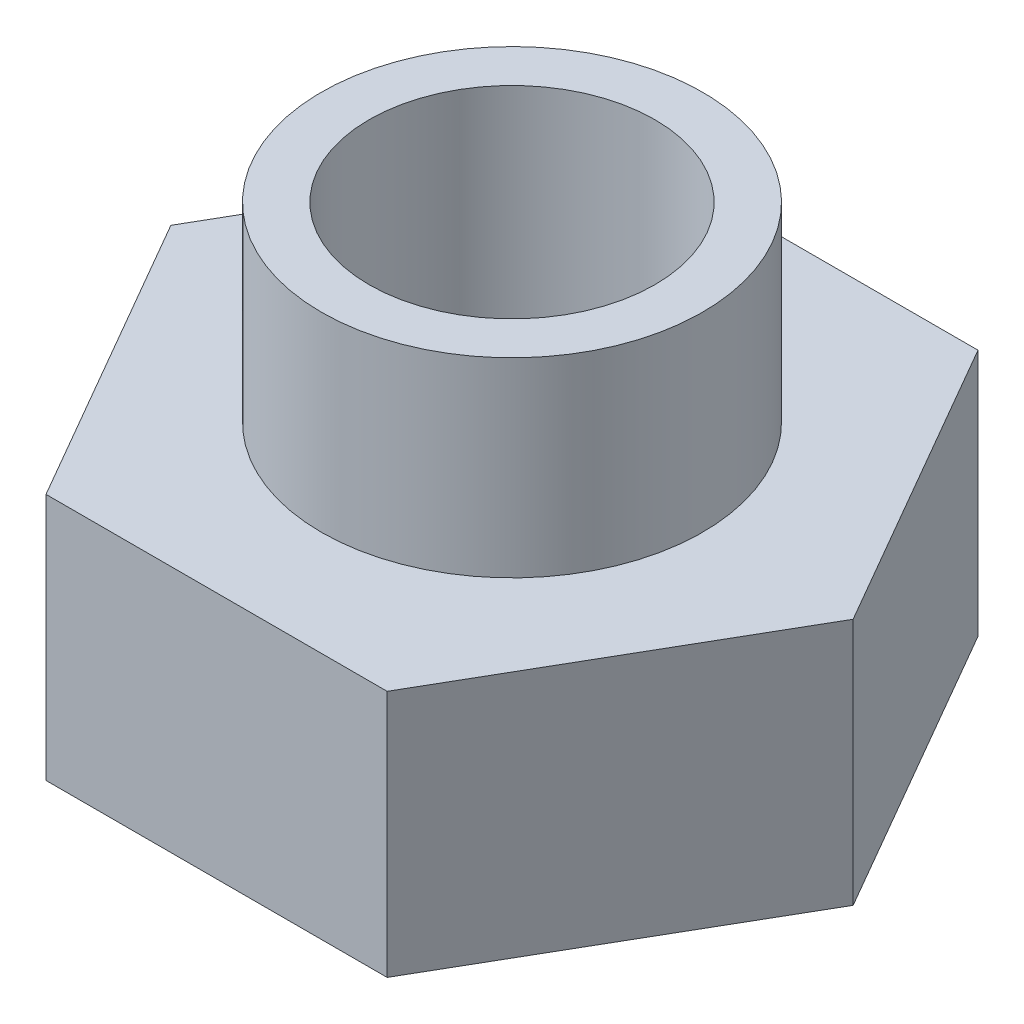
ISO-10303-21;
HEADER;
FILE_DESCRIPTION(('STEP AP214'),'2;1');
FILE_NAME('part.step','',(''),(''),'','','');
FILE_SCHEMA(('AUTOMOTIVE_DESIGN { 1 0 10303 214 1 1 1 1 }'));
ENDSEC;
DATA;
#1=APPLICATION_CONTEXT('core data for automotive mechanical design processes');
#2=APPLICATION_PROTOCOL_DEFINITION('international standard','automotive_design',2000,#1);
#3=PRODUCT_CONTEXT('',#1,'mechanical');
#4=PRODUCT('Part','Part','',(#3));
#5=PRODUCT_RELATED_PRODUCT_CATEGORY('part','',(#4));
#6=PRODUCT_DEFINITION_FORMATION('','',#4);
#7=PRODUCT_DEFINITION_CONTEXT('part definition',#1,'design');
#8=PRODUCT_DEFINITION('design','',#6,#7);
#9=PRODUCT_DEFINITION_SHAPE('','',#8);
#10=(LENGTH_UNIT() NAMED_UNIT(*) SI_UNIT(.MILLI.,.METRE.));
#11=(NAMED_UNIT(*) PLANE_ANGLE_UNIT() SI_UNIT($,.RADIAN.));
#12=(NAMED_UNIT(*) SI_UNIT($,.STERADIAN.) SOLID_ANGLE_UNIT());
#13=UNCERTAINTY_MEASURE_WITH_UNIT(LENGTH_MEASURE(1.E-05),#10,'distance_accuracy_value','');
#14=(GEOMETRIC_REPRESENTATION_CONTEXT(3) GLOBAL_UNCERTAINTY_ASSIGNED_CONTEXT((#13)) GLOBAL_UNIT_ASSIGNED_CONTEXT((#10,
#11,#12)) REPRESENTATION_CONTEXT('',''));
#15=CARTESIAN_POINT('',(0.,0.,0.));
#16=DIRECTION('',(0.,0.,1.));
#17=DIRECTION('',(1.,0.,0.));
#18=AXIS2_PLACEMENT_3D('',#15,#16,#17);
#19=CARTESIAN_POINT('',(8.05240624923115E-13,65.,77.5));
#20=DIRECTION('',(0.,0.,-1.));
#21=DIRECTION('',(-1.,0.,0.));
#22=AXIS2_PLACEMENT_3D('',#19,#20,#21);
#23=PLANE('',#22);
#24=DIRECTION('',(1.,0.,0.));
#25=VECTOR('',#24,1.);
#26=CARTESIAN_POINT('',(8.05240624923115E-13,0.,77.5));
#27=LINE('',#26,#25);
#28=CARTESIAN_POINT('',(-44.7446458621953,0.,77.5000000000005));
#29=VERTEX_POINT('',#28);
#30=CARTESIAN_POINT('',(44.7446458621969,0.,77.4999999999995));
#31=VERTEX_POINT('',#30);
#32=EDGE_CURVE('E123',#29,#31,#27,.T.);
#33=ORIENTED_EDGE('',*,*,#32,.T.);
#34=DIRECTION('',(0.,-1.,0.));
#35=VECTOR('',#34,1.);
#36=CARTESIAN_POINT('',(44.7446458621969,65.,77.4999999999995));
#37=LINE('',#36,#35);
#38=CARTESIAN_POINT('',(44.7446458621969,65.,77.4999999999995));
#39=VERTEX_POINT('',#38);
#40=EDGE_CURVE('E11',#39,#31,#37,.T.);
#41=ORIENTED_EDGE('',*,*,#40,.F.);
#42=DIRECTION('',(1.,0.,0.));
#43=VECTOR('',#42,1.);
#44=CARTESIAN_POINT('',(8.05240624923115E-13,65.,77.5));
#45=LINE('',#44,#43);
#46=CARTESIAN_POINT('',(-44.7446458621953,65.,77.5000000000005));
#47=VERTEX_POINT('',#46);
#48=EDGE_CURVE('E147',#47,#39,#45,.T.);
#49=ORIENTED_EDGE('',*,*,#48,.F.);
#50=DIRECTION('',(0.,-1.,0.));
#51=VECTOR('',#50,1.);
#52=CARTESIAN_POINT('',(-44.7446458621953,65.,77.5000000000005));
#53=LINE('',#52,#51);
#54=EDGE_CURVE('E119',#47,#29,#53,.T.);
#55=ORIENTED_EDGE('',*,*,#54,.T.);
#56=EDGE_LOOP('',(#33,#41,#49,#55));
#57=FACE_BOUND('',#56,.T.);
#58=ADVANCED_FACE('F39',(#57),#23,.F.);
#59=CARTESIAN_POINT('',(67.1169687932945,65.,38.7499999999998));
#60=DIRECTION('',(-0.866025403784441,0.,-0.499999999999995));
#61=DIRECTION('',(-0.499999999999995,0.,0.866025403784441));
#62=AXIS2_PLACEMENT_3D('',#59,#60,#61);
#63=PLANE('',#62);
#64=DIRECTION('',(0.499999999999995,0.,-0.866025403784442));
#65=VECTOR('',#64,1.);
#66=CARTESIAN_POINT('',(67.1169687932945,0.,38.7499999999998));
#67=LINE('',#66,#65);
#68=CARTESIAN_POINT('',(89.489291724392,0.,0.));
#69=VERTEX_POINT('',#68);
#70=EDGE_CURVE('E126',#31,#69,#67,.T.);
#71=ORIENTED_EDGE('',*,*,#70,.T.);
#72=DIRECTION('',(0.,-1.,0.));
#73=VECTOR('',#72,1.);
#74=CARTESIAN_POINT('',(89.489291724392,65.,0.));
#75=LINE('',#74,#73);
#76=CARTESIAN_POINT('',(89.489291724392,65.,0.));
#77=VERTEX_POINT('',#76);
#78=EDGE_CURVE('E47',#77,#69,#75,.T.);
#79=ORIENTED_EDGE('',*,*,#78,.F.);
#80=DIRECTION('',(0.499999999999995,0.,-0.866025403784442));
#81=VECTOR('',#80,1.);
#82=CARTESIAN_POINT('',(67.1169687932945,65.,38.7499999999998));
#83=LINE('',#82,#81);
#84=EDGE_CURVE('E92',#39,#77,#83,.T.);
#85=ORIENTED_EDGE('',*,*,#84,.F.);
#86=ORIENTED_EDGE('',*,*,#40,.T.);
#87=EDGE_LOOP('',(#71,#79,#85,#86));
#88=FACE_BOUND('',#87,.T.);
#89=ADVANCED_FACE('F160',(#88),#63,.F.);
#90=CARTESIAN_POINT('',(67.1169687932939,65.,-38.7500000000001));
#91=DIRECTION('',(-0.866025403784438,0.,0.500000000000001));
#92=DIRECTION('',(0.500000000000001,0.,0.866025403784438));
#93=AXIS2_PLACEMENT_3D('',#90,#91,#92);
#94=PLANE('',#93);
#95=DIRECTION('',(-0.500000000000001,0.,-0.866025403784438));
#96=VECTOR('',#95,1.);
#97=CARTESIAN_POINT('',(67.1169687932939,0.,-38.7500000000001));
#98=LINE('',#97,#96);
#99=CARTESIAN_POINT('',(44.7446458621958,0.,-77.5000000000002));
#100=VERTEX_POINT('',#99);
#101=EDGE_CURVE('E129',#69,#100,#98,.T.);
#102=ORIENTED_EDGE('',*,*,#101,.T.);
#103=DIRECTION('',(0.,-1.,0.));
#104=VECTOR('',#103,1.);
#105=CARTESIAN_POINT('',(44.7446458621958,65.,-77.5000000000002));
#106=LINE('',#105,#104);
#107=CARTESIAN_POINT('',(44.7446458621958,65.,-77.5000000000002));
#108=VERTEX_POINT('',#107);
#109=EDGE_CURVE('E114',#108,#100,#106,.T.);
#110=ORIENTED_EDGE('',*,*,#109,.F.);
#111=DIRECTION('',(-0.500000000000001,0.,-0.866025403784438));
#112=VECTOR('',#111,1.);
#113=CARTESIAN_POINT('',(67.1169687932939,65.,-38.7500000000001));
#114=LINE('',#113,#112);
#115=EDGE_CURVE('E105',#77,#108,#114,.T.);
#116=ORIENTED_EDGE('',*,*,#115,.F.);
#117=ORIENTED_EDGE('',*,*,#78,.T.);
#118=EDGE_LOOP('',(#102,#110,#116,#117));
#119=FACE_BOUND('',#118,.T.);
#120=ADVANCED_FACE('F140',(#119),#94,.F.);
#121=CARTESIAN_POINT('',(-2.64407369377739E-13,65.,-77.5));
#122=DIRECTION('',(0.,0.,1.));
#123=DIRECTION('',(1.,0.,0.));
#124=AXIS2_PLACEMENT_3D('',#121,#122,#123);
#125=PLANE('',#124);
#126=DIRECTION('',(-1.,0.,0.));
#127=VECTOR('',#126,1.);
#128=CARTESIAN_POINT('',(-2.64407369377739E-13,0.,-77.5));
#129=LINE('',#128,#127);
#130=CARTESIAN_POINT('',(-44.7446458621964,0.,-77.4999999999998));
#131=VERTEX_POINT('',#130);
#132=EDGE_CURVE('E113',#100,#131,#129,.T.);
#133=ORIENTED_EDGE('',*,*,#132,.T.);
#134=DIRECTION('',(0.,-1.,0.));
#135=VECTOR('',#134,1.);
#136=CARTESIAN_POINT('',(-44.7446458621964,65.,-77.4999999999998));
#137=LINE('',#136,#135);
#138=CARTESIAN_POINT('',(-44.7446458621964,65.,-77.4999999999998));
#139=VERTEX_POINT('',#138);
#140=EDGE_CURVE('E110',#139,#131,#137,.T.);
#141=ORIENTED_EDGE('',*,*,#140,.F.);
#142=DIRECTION('',(-1.,0.,0.));
#143=VECTOR('',#142,1.);
#144=CARTESIAN_POINT('',(-2.64407369377739E-13,65.,-77.5));
#145=LINE('',#144,#143);
#146=EDGE_CURVE('E99',#108,#139,#145,.T.);
#147=ORIENTED_EDGE('',*,*,#146,.F.);
#148=ORIENTED_EDGE('',*,*,#109,.T.);
#149=EDGE_LOOP('',(#133,#141,#147,#148));
#150=FACE_BOUND('',#149,.T.);
#151=ADVANCED_FACE('F111',(#150),#125,.F.);
#152=CARTESIAN_POINT('',(-67.1169687932942,65.,-38.7499999999996));
#153=DIRECTION('',(0.866025403784442,0.,0.499999999999995));
#154=DIRECTION('',(0.499999999999995,0.,-0.866025403784442));
#155=AXIS2_PLACEMENT_3D('',#152,#153,#154);
#156=PLANE('',#155);
#157=DIRECTION('',(-0.499999999999995,0.,0.866025403784442));
#158=VECTOR('',#157,1.);
#159=CARTESIAN_POINT('',(-67.1169687932942,0.,-38.7499999999996));
#160=LINE('',#159,#158);
#161=CARTESIAN_POINT('',(-89.489291724392,0.,6.31439345255558E-13));
#162=VERTEX_POINT('',#161);
#163=EDGE_CURVE('E78',#131,#162,#160,.T.);
#164=ORIENTED_EDGE('',*,*,#163,.T.);
#165=DIRECTION('',(0.,-1.,0.));
#166=VECTOR('',#165,1.);
#167=CARTESIAN_POINT('',(-89.489291724392,65.,6.31439345255558E-13));
#168=LINE('',#167,#166);
#169=CARTESIAN_POINT('',(-89.489291724392,65.,6.31439345255558E-13));
#170=VERTEX_POINT('',#169);
#171=EDGE_CURVE('E115',#170,#162,#168,.T.);
#172=ORIENTED_EDGE('',*,*,#171,.F.);
#173=DIRECTION('',(-0.499999999999995,0.,0.866025403784442));
#174=VECTOR('',#173,1.);
#175=CARTESIAN_POINT('',(-67.1169687932942,65.,-38.7499999999996));
#176=LINE('',#175,#174);
#177=EDGE_CURVE('E103',#139,#170,#176,.T.);
#178=ORIENTED_EDGE('',*,*,#177,.F.);
#179=ORIENTED_EDGE('',*,*,#140,.T.);
#180=EDGE_LOOP('',(#164,#172,#178,#179));
#181=FACE_BOUND('',#180,.T.);
#182=ADVANCED_FACE('F117',(#181),#156,.F.);
#183=CARTESIAN_POINT('',(-67.1169687932937,65.,38.7500000000005));
#184=DIRECTION('',(0.866025403784434,0.,-0.500000000000007));
#185=DIRECTION('',(-0.500000000000007,0.,-0.866025403784435));
#186=AXIS2_PLACEMENT_3D('',#183,#184,#185);
#187=PLANE('',#186);
#188=DIRECTION('',(0.500000000000007,0.,0.866025403784435));
#189=VECTOR('',#188,1.);
#190=CARTESIAN_POINT('',(-67.1169687932937,0.,38.7500000000005));
#191=LINE('',#190,#189);
#192=EDGE_CURVE('E84',#162,#29,#191,.T.);
#193=ORIENTED_EDGE('',*,*,#192,.T.);
#194=ORIENTED_EDGE('',*,*,#54,.F.);
#195=DIRECTION('',(0.500000000000007,0.,0.866025403784435));
#196=VECTOR('',#195,1.);
#197=CARTESIAN_POINT('',(-67.1169687932937,65.,38.7500000000005));
#198=LINE('',#197,#196);
#199=EDGE_CURVE('E55',#170,#47,#198,.T.);
#200=ORIENTED_EDGE('',*,*,#199,.F.);
#201=ORIENTED_EDGE('',*,*,#171,.T.);
#202=EDGE_LOOP('',(#193,#194,#200,#201));
#203=FACE_BOUND('',#202,.T.);
#204=ADVANCED_FACE('F148',(#203),#187,.F.);
#205=CARTESIAN_POINT('',(0.,65.,0.));
#206=DIRECTION('',(0.,1.,0.));
#207=DIRECTION('',(0.,0.,1.));
#208=AXIS2_PLACEMENT_3D('',#205,#206,#207);
#209=PLANE('',#208);
#210=CARTESIAN_POINT('',(0.,65.,0.));
#211=DIRECTION('',(0.,1.,0.));
#212=DIRECTION('',(0.,0.,1.));
#213=AXIS2_PLACEMENT_3D('',#210,#211,#212);
#214=CIRCLE('',#213,50.);
#215=CARTESIAN_POINT('',(0.,65.,50.));
#216=VERTEX_POINT('',#215);
#217=EDGE_CURVE('E134',#216,#216,#214,.T.);
#218=ORIENTED_EDGE('',*,*,#217,.F.);
#219=EDGE_LOOP('',(#218));
#220=FACE_BOUND('',#219,.T.);
#221=ORIENTED_EDGE('',*,*,#48,.T.);
#222=ORIENTED_EDGE('',*,*,#84,.T.);
#223=ORIENTED_EDGE('',*,*,#115,.T.);
#224=ORIENTED_EDGE('',*,*,#146,.T.);
#225=ORIENTED_EDGE('',*,*,#177,.T.);
#226=ORIENTED_EDGE('',*,*,#199,.T.);
#227=EDGE_LOOP('',(#221,#222,#223,#224,#225,#226));
#228=FACE_BOUND('',#227,.T.);
#229=ADVANCED_FACE('F101',(#220,#228),#209,.T.);
#230=CARTESIAN_POINT('',(0.,0.,0.));
#231=DIRECTION('',(0.,1.,0.));
#232=DIRECTION('',(0.,0.,1.));
#233=AXIS2_PLACEMENT_3D('',#230,#231,#232);
#234=PLANE('',#233);
#235=CARTESIAN_POINT('',(0.,0.,0.));
#236=DIRECTION('',(0.,1.,0.));
#237=DIRECTION('',(0.,0.,1.));
#238=AXIS2_PLACEMENT_3D('',#235,#236,#237);
#239=CIRCLE('',#238,37.5);
#240=CARTESIAN_POINT('',(0.,0.,37.5));
#241=VERTEX_POINT('',#240);
#242=EDGE_CURVE('E275',#241,#241,#239,.T.);
#243=ORIENTED_EDGE('',*,*,#242,.T.);
#244=EDGE_LOOP('',(#243));
#245=FACE_BOUND('',#244,.T.);
#246=ORIENTED_EDGE('',*,*,#32,.F.);
#247=ORIENTED_EDGE('',*,*,#192,.F.);
#248=ORIENTED_EDGE('',*,*,#163,.F.);
#249=ORIENTED_EDGE('',*,*,#132,.F.);
#250=ORIENTED_EDGE('',*,*,#101,.F.);
#251=ORIENTED_EDGE('',*,*,#70,.F.);
#252=EDGE_LOOP('',(#246,#247,#248,#249,#250,#251));
#253=FACE_BOUND('',#252,.T.);
#254=ADVANCED_FACE('F143',(#245,#253),#234,.F.);
#255=CARTESIAN_POINT('',(0.,115.,0.));
#256=DIRECTION('',(0.,-1.,0.));
#257=DIRECTION('',(0.,0.,-1.));
#258=AXIS2_PLACEMENT_3D('',#255,#256,#257);
#259=CYLINDRICAL_SURFACE('',#258,50.);
#260=ORIENTED_EDGE('',*,*,#217,.T.);
#261=EDGE_LOOP('',(#260));
#262=FACE_BOUND('',#261,.T.);
#263=CARTESIAN_POINT('',(0.,115.,0.));
#264=DIRECTION('',(0.,1.,0.));
#265=DIRECTION('',(0.,0.,1.));
#266=AXIS2_PLACEMENT_3D('',#263,#264,#265);
#267=CIRCLE('',#266,50.);
#268=CARTESIAN_POINT('',(0.,115.,50.));
#269=VERTEX_POINT('',#268);
#270=EDGE_CURVE('E127',#269,#269,#267,.T.);
#271=ORIENTED_EDGE('',*,*,#270,.F.);
#272=EDGE_LOOP('',(#271));
#273=FACE_BOUND('',#272,.T.);
#274=ADVANCED_FACE('F198',(#262,#273),#259,.T.);
#275=CARTESIAN_POINT('',(0.,115.,0.));
#276=DIRECTION('',(0.,1.,0.));
#277=DIRECTION('',(0.,0.,1.));
#278=AXIS2_PLACEMENT_3D('',#275,#276,#277);
#279=PLANE('',#278);
#280=CARTESIAN_POINT('',(0.,115.,0.));
#281=DIRECTION('',(0.,1.,0.));
#282=DIRECTION('',(0.,0.,1.));
#283=AXIS2_PLACEMENT_3D('',#280,#281,#282);
#284=CIRCLE('',#283,37.5);
#285=CARTESIAN_POINT('',(0.,115.,37.5));
#286=VERTEX_POINT('',#285);
#287=EDGE_CURVE('E272',#286,#286,#284,.T.);
#288=ORIENTED_EDGE('',*,*,#287,.F.);
#289=EDGE_LOOP('',(#288));
#290=FACE_BOUND('',#289,.T.);
#291=ORIENTED_EDGE('',*,*,#270,.T.);
#292=EDGE_LOOP('',(#291));
#293=FACE_BOUND('',#292,.T.);
#294=ADVANCED_FACE('F203',(#290,#293),#279,.T.);
#295=CARTESIAN_POINT('',(0.,115.,0.));
#296=DIRECTION('',(0.,-1.,0.));
#297=DIRECTION('',(0.,0.,-1.));
#298=AXIS2_PLACEMENT_3D('',#295,#296,#297);
#299=CYLINDRICAL_SURFACE('',#298,37.5);
#300=ORIENTED_EDGE('',*,*,#287,.T.);
#301=EDGE_LOOP('',(#300));
#302=FACE_BOUND('',#301,.T.);
#303=ORIENTED_EDGE('',*,*,#242,.F.);
#304=EDGE_LOOP('',(#303));
#305=FACE_BOUND('',#304,.T.);
#306=ADVANCED_FACE('F221',(#302,#305),#299,.F.);
#307=CLOSED_SHELL('',(#58,#89,#120,#151,#182,#204,#229,#254,#274,#294,#306));
#308=MANIFOLD_SOLID_BREP('B2',#307);
#309=ADVANCED_BREP_SHAPE_REPRESENTATION('',(#18,#308),#14);
#310=SHAPE_DEFINITION_REPRESENTATION(#9,#309);
ENDSEC;
END-ISO-10303-21;
